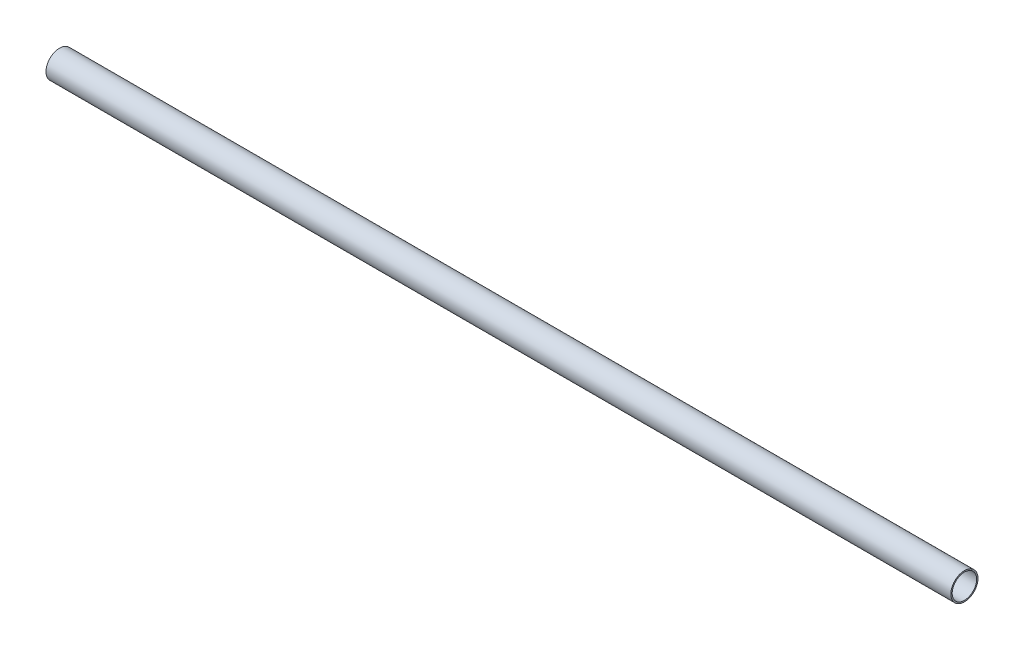
ISO-10303-21;
HEADER;
FILE_DESCRIPTION(('STEP AP214'),'2;1');
FILE_NAME('part.step','',(''),(''),'','','');
FILE_SCHEMA(('AUTOMOTIVE_DESIGN { 1 0 10303 214 1 1 1 1 }'));
ENDSEC;
DATA;
#1=APPLICATION_CONTEXT('core data for automotive mechanical design processes');
#2=APPLICATION_PROTOCOL_DEFINITION('international standard','automotive_design',2000,#1);
#3=PRODUCT_CONTEXT('',#1,'mechanical');
#4=PRODUCT('Part','Part','',(#3));
#5=PRODUCT_RELATED_PRODUCT_CATEGORY('part','',(#4));
#6=PRODUCT_DEFINITION_FORMATION('','',#4);
#7=PRODUCT_DEFINITION_CONTEXT('part definition',#1,'design');
#8=PRODUCT_DEFINITION('design','',#6,#7);
#9=PRODUCT_DEFINITION_SHAPE('','',#8);
#10=(LENGTH_UNIT() NAMED_UNIT(*) SI_UNIT(.MILLI.,.METRE.));
#11=(NAMED_UNIT(*) PLANE_ANGLE_UNIT() SI_UNIT($,.RADIAN.));
#12=(NAMED_UNIT(*) SI_UNIT($,.STERADIAN.) SOLID_ANGLE_UNIT());
#13=UNCERTAINTY_MEASURE_WITH_UNIT(LENGTH_MEASURE(1.E-05),#10,'distance_accuracy_value','');
#14=(GEOMETRIC_REPRESENTATION_CONTEXT(3) GLOBAL_UNCERTAINTY_ASSIGNED_CONTEXT((#13)) GLOBAL_UNIT_ASSIGNED_CONTEXT((#10,
#11,#12)) REPRESENTATION_CONTEXT('',''));
#15=CARTESIAN_POINT('',(0.,0.,0.));
#16=DIRECTION('',(0.,0.,1.));
#17=DIRECTION('',(1.,0.,0.));
#18=AXIS2_PLACEMENT_3D('',#15,#16,#17);
#19=CARTESIAN_POINT('',(1000.,0.,0.));
#20=DIRECTION('',(1.,0.,0.));
#21=DIRECTION('',(0.,0.,-1.));
#22=AXIS2_PLACEMENT_3D('',#19,#20,#21);
#23=PLANE('',#22);
#24=CARTESIAN_POINT('',(1000.,0.,0.));
#25=DIRECTION('',(1.,0.,0.));
#26=DIRECTION('',(0.,0.,-1.));
#27=AXIS2_PLACEMENT_3D('',#24,#25,#26);
#28=CIRCLE('',#27,15.);
#29=CARTESIAN_POINT('',(1000.,0.,-15.));
#30=VERTEX_POINT('',#29);
#31=EDGE_CURVE('E10',#30,#30,#28,.T.);
#32=ORIENTED_EDGE('',*,*,#31,.T.);
#33=EDGE_LOOP('',(#32));
#34=FACE_BOUND('',#33,.T.);
#35=CARTESIAN_POINT('',(1000.,0.,0.));
#36=DIRECTION('',(1.,0.,0.));
#37=DIRECTION('',(0.,0.,-1.));
#38=AXIS2_PLACEMENT_3D('',#35,#36,#37);
#39=CIRCLE('',#38,13.5);
#40=CARTESIAN_POINT('',(1000.,0.,-13.5));
#41=VERTEX_POINT('',#40);
#42=EDGE_CURVE('E53',#41,#41,#39,.T.);
#43=ORIENTED_EDGE('',*,*,#42,.F.);
#44=EDGE_LOOP('',(#43));
#45=FACE_BOUND('',#44,.T.);
#46=ADVANCED_FACE('F43',(#34,#45),#23,.T.);
#47=CARTESIAN_POINT('',(0.,0.,0.));
#48=DIRECTION('',(1.,0.,0.));
#49=DIRECTION('',(0.,0.,-1.));
#50=AXIS2_PLACEMENT_3D('',#47,#48,#49);
#51=PLANE('',#50);
#52=CARTESIAN_POINT('',(0.,0.,0.));
#53=DIRECTION('',(1.,0.,0.));
#54=DIRECTION('',(0.,0.,-1.));
#55=AXIS2_PLACEMENT_3D('',#52,#53,#54);
#56=CIRCLE('',#55,15.);
#57=CARTESIAN_POINT('',(0.,0.,-15.));
#58=VERTEX_POINT('',#57);
#59=EDGE_CURVE('E50',#58,#58,#56,.T.);
#60=ORIENTED_EDGE('',*,*,#59,.F.);
#61=EDGE_LOOP('',(#60));
#62=FACE_BOUND('',#61,.T.);
#63=CARTESIAN_POINT('',(0.,0.,0.));
#64=DIRECTION('',(1.,0.,0.));
#65=DIRECTION('',(0.,0.,-1.));
#66=AXIS2_PLACEMENT_3D('',#63,#64,#65);
#67=CIRCLE('',#66,13.5);
#68=CARTESIAN_POINT('',(0.,0.,-13.5));
#69=VERTEX_POINT('',#68);
#70=EDGE_CURVE('E57',#69,#69,#67,.T.);
#71=ORIENTED_EDGE('',*,*,#70,.T.);
#72=EDGE_LOOP('',(#71));
#73=FACE_BOUND('',#72,.T.);
#74=ADVANCED_FACE('F68',(#62,#73),#51,.F.);
#75=CARTESIAN_POINT('',(1000.,0.,0.));
#76=DIRECTION('',(-1.,0.,0.));
#77=DIRECTION('',(0.,0.,1.));
#78=AXIS2_PLACEMENT_3D('',#75,#76,#77);
#79=CYLINDRICAL_SURFACE('',#78,15.);
#80=ORIENTED_EDGE('',*,*,#31,.F.);
#81=EDGE_LOOP('',(#80));
#82=FACE_BOUND('',#81,.T.);
#83=ORIENTED_EDGE('',*,*,#59,.T.);
#84=EDGE_LOOP('',(#83));
#85=FACE_BOUND('',#84,.T.);
#86=ADVANCED_FACE('F44',(#82,#85),#79,.T.);
#87=CARTESIAN_POINT('',(1000.,0.,0.));
#88=DIRECTION('',(-1.,0.,0.));
#89=DIRECTION('',(0.,0.,1.));
#90=AXIS2_PLACEMENT_3D('',#87,#88,#89);
#91=CYLINDRICAL_SURFACE('',#90,13.5);
#92=ORIENTED_EDGE('',*,*,#42,.T.);
#93=EDGE_LOOP('',(#92));
#94=FACE_BOUND('',#93,.T.);
#95=ORIENTED_EDGE('',*,*,#70,.F.);
#96=EDGE_LOOP('',(#95));
#97=FACE_BOUND('',#96,.T.);
#98=ADVANCED_FACE('F65',(#94,#97),#91,.F.);
#99=CLOSED_SHELL('',(#46,#74,#86,#98));
#100=MANIFOLD_SOLID_BREP('B2',#99);
#101=ADVANCED_BREP_SHAPE_REPRESENTATION('',(#18,#100),#14);
#102=SHAPE_DEFINITION_REPRESENTATION(#9,#101);
ENDSEC;
END-ISO-10303-21;
